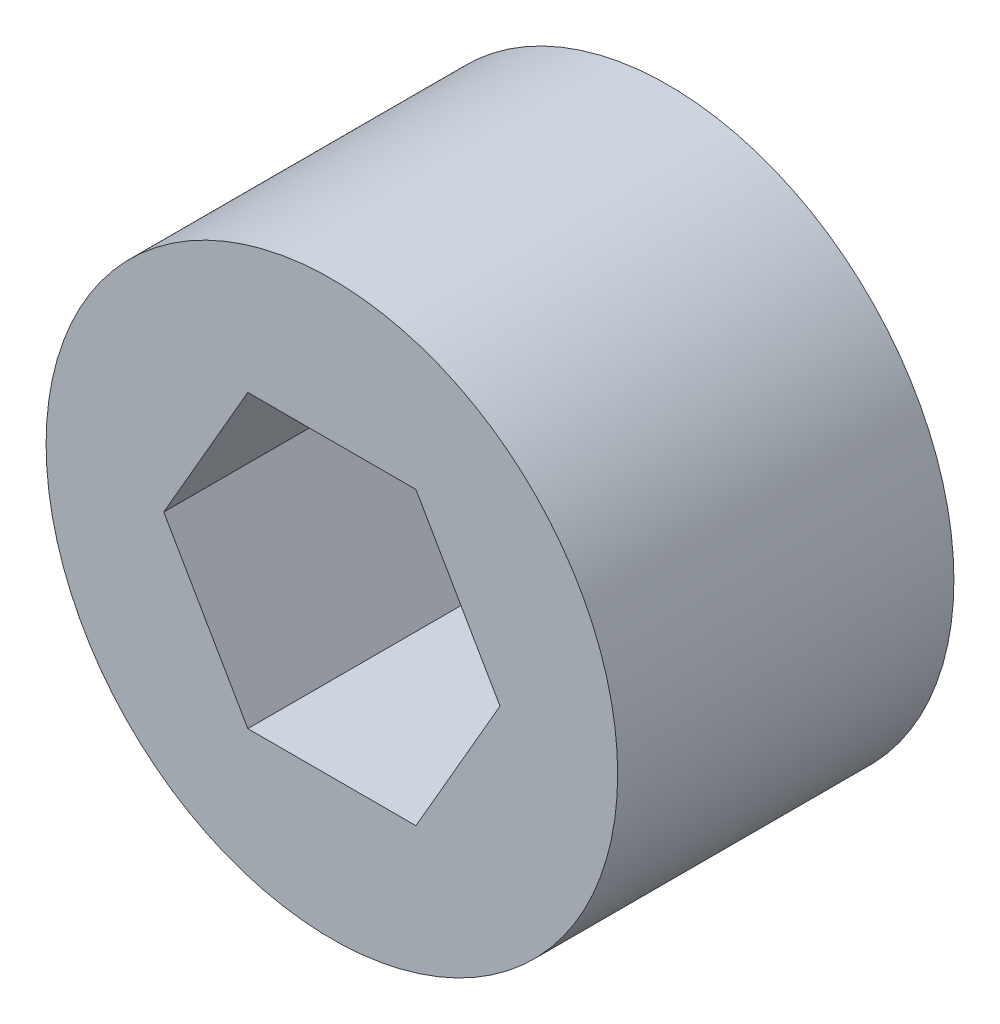
ISO-10303-21;
HEADER;
FILE_DESCRIPTION(('STEP AP214'),'2;1');
FILE_NAME('part.step','',(''),(''),'','','');
FILE_SCHEMA(('AUTOMOTIVE_DESIGN { 1 0 10303 214 1 1 1 1 }'));
ENDSEC;
DATA;
#1=APPLICATION_CONTEXT('core data for automotive mechanical design processes');
#2=APPLICATION_PROTOCOL_DEFINITION('international standard','automotive_design',2000,#1);
#3=PRODUCT_CONTEXT('',#1,'mechanical');
#4=PRODUCT('Part','Part','',(#3));
#5=PRODUCT_RELATED_PRODUCT_CATEGORY('part','',(#4));
#6=PRODUCT_DEFINITION_FORMATION('','',#4);
#7=PRODUCT_DEFINITION_CONTEXT('part definition',#1,'design');
#8=PRODUCT_DEFINITION('design','',#6,#7);
#9=PRODUCT_DEFINITION_SHAPE('','',#8);
#10=(LENGTH_UNIT() NAMED_UNIT(*) SI_UNIT(.MILLI.,.METRE.));
#11=(NAMED_UNIT(*) PLANE_ANGLE_UNIT() SI_UNIT($,.RADIAN.));
#12=(NAMED_UNIT(*) SI_UNIT($,.STERADIAN.) SOLID_ANGLE_UNIT());
#13=UNCERTAINTY_MEASURE_WITH_UNIT(LENGTH_MEASURE(1.E-05),#10,'distance_accuracy_value','');
#14=(GEOMETRIC_REPRESENTATION_CONTEXT(3) GLOBAL_UNCERTAINTY_ASSIGNED_CONTEXT((#13)) GLOBAL_UNIT_ASSIGNED_CONTEXT((#10,
#11,#12)) REPRESENTATION_CONTEXT('',''));
#15=CARTESIAN_POINT('',(0.,0.,0.));
#16=DIRECTION('',(0.,0.,1.));
#17=DIRECTION('',(1.,0.,0.));
#18=AXIS2_PLACEMENT_3D('',#15,#16,#17);
#19=CARTESIAN_POINT('',(0.,0.,10.));
#20=DIRECTION('',(0.,0.,1.));
#21=DIRECTION('',(1.,0.,0.));
#22=AXIS2_PLACEMENT_3D('',#19,#20,#21);
#23=PLANE('',#22);
#24=CARTESIAN_POINT('',(0.,0.,10.));
#25=DIRECTION('',(0.,0.,1.));
#26=DIRECTION('',(1.,0.,0.));
#27=AXIS2_PLACEMENT_3D('',#24,#25,#26);
#28=CIRCLE('',#27,8.5);
#29=CARTESIAN_POINT('',(8.5,0.,10.));
#30=VERTEX_POINT('',#29);
#31=EDGE_CURVE('E11',#30,#30,#28,.T.);
#32=ORIENTED_EDGE('',*,*,#31,.T.);
#33=EDGE_LOOP('',(#32));
#34=FACE_BOUND('',#33,.T.);
#35=DIRECTION('',(0.5,0.866025403784439,0.));
#36=VECTOR('',#35,1.);
#37=CARTESIAN_POINT('',(2.5,-4.33012701892219,10.));
#38=LINE('',#37,#36);
#39=CARTESIAN_POINT('',(2.5,-4.33012701892219,10.));
#40=VERTEX_POINT('',#39);
#41=CARTESIAN_POINT('',(5.,0.,10.));
#42=VERTEX_POINT('',#41);
#43=EDGE_CURVE('E94',#40,#42,#38,.T.);
#44=ORIENTED_EDGE('',*,*,#43,.F.);
#45=DIRECTION('',(1.,0.,0.));
#46=VECTOR('',#45,1.);
#47=CARTESIAN_POINT('',(-2.5,-4.33012701892219,10.));
#48=LINE('',#47,#46);
#49=CARTESIAN_POINT('',(-2.5,-4.33012701892219,10.));
#50=VERTEX_POINT('',#49);
#51=EDGE_CURVE('E86',#50,#40,#48,.T.);
#52=ORIENTED_EDGE('',*,*,#51,.F.);
#53=DIRECTION('',(0.5,-0.866025403784439,0.));
#54=VECTOR('',#53,1.);
#55=CARTESIAN_POINT('',(-5.,0.,10.));
#56=LINE('',#55,#54);
#57=CARTESIAN_POINT('',(-5.,0.,10.));
#58=VERTEX_POINT('',#57);
#59=EDGE_CURVE('E114',#58,#50,#56,.T.);
#60=ORIENTED_EDGE('',*,*,#59,.F.);
#61=DIRECTION('',(-0.5,-0.866025403784439,0.));
#62=VECTOR('',#61,1.);
#63=CARTESIAN_POINT('',(-2.5,4.33012701892219,10.));
#64=LINE('',#63,#62);
#65=CARTESIAN_POINT('',(-2.5,4.33012701892219,10.));
#66=VERTEX_POINT('',#65);
#67=EDGE_CURVE('E112',#66,#58,#64,.T.);
#68=ORIENTED_EDGE('',*,*,#67,.F.);
#69=DIRECTION('',(-1.,0.,0.));
#70=VECTOR('',#69,1.);
#71=CARTESIAN_POINT('',(2.5,4.33012701892219,10.));
#72=LINE('',#71,#70);
#73=CARTESIAN_POINT('',(2.5,4.33012701892219,10.));
#74=VERTEX_POINT('',#73);
#75=EDGE_CURVE('E108',#74,#66,#72,.T.);
#76=ORIENTED_EDGE('',*,*,#75,.F.);
#77=DIRECTION('',(-0.5,0.866025403784439,0.));
#78=VECTOR('',#77,1.);
#79=CARTESIAN_POINT('',(5.,0.,10.));
#80=LINE('',#79,#78);
#81=EDGE_CURVE('E106',#42,#74,#80,.T.);
#82=ORIENTED_EDGE('',*,*,#81,.F.);
#83=EDGE_LOOP('',(#44,#52,#60,#68,#76,#82));
#84=FACE_BOUND('',#83,.T.);
#85=ADVANCED_FACE('F33',(#34,#84),#23,.T.);
#86=CARTESIAN_POINT('',(0.,0.,0.));
#87=DIRECTION('',(0.,0.,1.));
#88=DIRECTION('',(1.,0.,0.));
#89=AXIS2_PLACEMENT_3D('',#86,#87,#88);
#90=PLANE('',#89);
#91=CARTESIAN_POINT('',(0.,0.,0.));
#92=DIRECTION('',(0.,0.,1.));
#93=DIRECTION('',(1.,0.,0.));
#94=AXIS2_PLACEMENT_3D('',#91,#92,#93);
#95=CIRCLE('',#94,8.5);
#96=CARTESIAN_POINT('',(8.5,0.,0.));
#97=VERTEX_POINT('',#96);
#98=EDGE_CURVE('E37',#97,#97,#95,.T.);
#99=ORIENTED_EDGE('',*,*,#98,.F.);
#100=EDGE_LOOP('',(#99));
#101=FACE_BOUND('',#100,.T.);
#102=DIRECTION('',(1.,0.,0.));
#103=VECTOR('',#102,1.);
#104=CARTESIAN_POINT('',(-2.5,-4.33012701892219,0.));
#105=LINE('',#104,#103);
#106=CARTESIAN_POINT('',(-2.5,-4.33012701892219,0.));
#107=VERTEX_POINT('',#106);
#108=CARTESIAN_POINT('',(2.5,-4.33012701892219,0.));
#109=VERTEX_POINT('',#108);
#110=EDGE_CURVE('E56',#107,#109,#105,.T.);
#111=ORIENTED_EDGE('',*,*,#110,.T.);
#112=DIRECTION('',(0.5,0.866025403784439,0.));
#113=VECTOR('',#112,1.);
#114=CARTESIAN_POINT('',(2.5,-4.33012701892219,0.));
#115=LINE('',#114,#113);
#116=CARTESIAN_POINT('',(5.,0.,0.));
#117=VERTEX_POINT('',#116);
#118=EDGE_CURVE('E101',#109,#117,#115,.T.);
#119=ORIENTED_EDGE('',*,*,#118,.T.);
#120=DIRECTION('',(-0.5,0.866025403784439,0.));
#121=VECTOR('',#120,1.);
#122=CARTESIAN_POINT('',(5.,0.,0.));
#123=LINE('',#122,#121);
#124=CARTESIAN_POINT('',(2.5,4.33012701892219,0.));
#125=VERTEX_POINT('',#124);
#126=EDGE_CURVE('E118',#117,#125,#123,.T.);
#127=ORIENTED_EDGE('',*,*,#126,.T.);
#128=DIRECTION('',(-1.,0.,0.));
#129=VECTOR('',#128,1.);
#130=CARTESIAN_POINT('',(2.5,4.33012701892219,0.));
#131=LINE('',#130,#129);
#132=CARTESIAN_POINT('',(-2.5,4.33012701892219,0.));
#133=VERTEX_POINT('',#132);
#134=EDGE_CURVE('E121',#125,#133,#131,.T.);
#135=ORIENTED_EDGE('',*,*,#134,.T.);
#136=DIRECTION('',(-0.5,-0.866025403784439,0.));
#137=VECTOR('',#136,1.);
#138=CARTESIAN_POINT('',(-2.5,4.33012701892219,0.));
#139=LINE('',#138,#137);
#140=CARTESIAN_POINT('',(-5.,0.,0.));
#141=VERTEX_POINT('',#140);
#142=EDGE_CURVE('E124',#133,#141,#139,.T.);
#143=ORIENTED_EDGE('',*,*,#142,.T.);
#144=DIRECTION('',(0.5,-0.866025403784439,0.));
#145=VECTOR('',#144,1.);
#146=CARTESIAN_POINT('',(-5.,0.,0.));
#147=LINE('',#146,#145);
#148=EDGE_CURVE('E95',#141,#107,#147,.T.);
#149=ORIENTED_EDGE('',*,*,#148,.T.);
#150=EDGE_LOOP('',(#111,#119,#127,#135,#143,#149));
#151=FACE_BOUND('',#150,.T.);
#152=ADVANCED_FACE('F141',(#101,#151),#90,.F.);
#153=CARTESIAN_POINT('',(0.,0.,10.));
#154=DIRECTION('',(0.,0.,-1.));
#155=DIRECTION('',(-1.,0.,0.));
#156=AXIS2_PLACEMENT_3D('',#153,#154,#155);
#157=CYLINDRICAL_SURFACE('',#156,8.5);
#158=ORIENTED_EDGE('',*,*,#31,.F.);
#159=EDGE_LOOP('',(#158));
#160=FACE_BOUND('',#159,.T.);
#161=ORIENTED_EDGE('',*,*,#98,.T.);
#162=EDGE_LOOP('',(#161));
#163=FACE_BOUND('',#162,.T.);
#164=ADVANCED_FACE('F35',(#160,#163),#157,.T.);
#165=CARTESIAN_POINT('',(-2.5,-4.33012701892219,10.));
#166=DIRECTION('',(0.,1.,0.));
#167=DIRECTION('',(-1.,0.,0.));
#168=AXIS2_PLACEMENT_3D('',#165,#166,#167);
#169=PLANE('',#168);
#170=ORIENTED_EDGE('',*,*,#110,.F.);
#171=DIRECTION('',(0.,0.,-1.));
#172=VECTOR('',#171,1.);
#173=CARTESIAN_POINT('',(-2.5,-4.33012701892219,10.));
#174=LINE('',#173,#172);
#175=EDGE_CURVE('E90',#50,#107,#174,.T.);
#176=ORIENTED_EDGE('',*,*,#175,.F.);
#177=ORIENTED_EDGE('',*,*,#51,.T.);
#178=DIRECTION('',(0.,0.,-1.));
#179=VECTOR('',#178,1.);
#180=CARTESIAN_POINT('',(2.5,-4.33012701892219,10.));
#181=LINE('',#180,#179);
#182=EDGE_CURVE('E89',#40,#109,#181,.T.);
#183=ORIENTED_EDGE('',*,*,#182,.T.);
#184=EDGE_LOOP('',(#170,#176,#177,#183));
#185=FACE_BOUND('',#184,.T.);
#186=ADVANCED_FACE('F88',(#185),#169,.T.);
#187=CARTESIAN_POINT('',(2.5,-4.33012701892219,10.));
#188=DIRECTION('',(-0.866025403784439,0.5,0.));
#189=DIRECTION('',(-0.5,-0.866025403784439,0.));
#190=AXIS2_PLACEMENT_3D('',#187,#188,#189);
#191=PLANE('',#190);
#192=ORIENTED_EDGE('',*,*,#118,.F.);
#193=ORIENTED_EDGE('',*,*,#182,.F.);
#194=ORIENTED_EDGE('',*,*,#43,.T.);
#195=DIRECTION('',(0.,0.,-1.));
#196=VECTOR('',#195,1.);
#197=CARTESIAN_POINT('',(5.,0.,10.));
#198=LINE('',#197,#196);
#199=EDGE_CURVE('E102',#42,#117,#198,.T.);
#200=ORIENTED_EDGE('',*,*,#199,.T.);
#201=EDGE_LOOP('',(#192,#193,#194,#200));
#202=FACE_BOUND('',#201,.T.);
#203=ADVANCED_FACE('F98',(#202),#191,.T.);
#204=CARTESIAN_POINT('',(5.,0.,10.));
#205=DIRECTION('',(-0.866025403784438,-0.5,0.));
#206=DIRECTION('',(0.5,-0.866025403784439,0.));
#207=AXIS2_PLACEMENT_3D('',#204,#205,#206);
#208=PLANE('',#207);
#209=ORIENTED_EDGE('',*,*,#126,.F.);
#210=ORIENTED_EDGE('',*,*,#199,.F.);
#211=ORIENTED_EDGE('',*,*,#81,.T.);
#212=DIRECTION('',(0.,0.,-1.));
#213=VECTOR('',#212,1.);
#214=CARTESIAN_POINT('',(2.5,4.33012701892219,10.));
#215=LINE('',#214,#213);
#216=EDGE_CURVE('E133',#74,#125,#215,.T.);
#217=ORIENTED_EDGE('',*,*,#216,.T.);
#218=EDGE_LOOP('',(#209,#210,#211,#217));
#219=FACE_BOUND('',#218,.T.);
#220=ADVANCED_FACE('F137',(#219),#208,.T.);
#221=CARTESIAN_POINT('',(2.5,4.33012701892219,10.));
#222=DIRECTION('',(0.,-1.,0.));
#223=DIRECTION('',(1.,0.,0.));
#224=AXIS2_PLACEMENT_3D('',#221,#222,#223);
#225=PLANE('',#224);
#226=ORIENTED_EDGE('',*,*,#134,.F.);
#227=ORIENTED_EDGE('',*,*,#216,.F.);
#228=ORIENTED_EDGE('',*,*,#75,.T.);
#229=DIRECTION('',(0.,0.,-1.));
#230=VECTOR('',#229,1.);
#231=CARTESIAN_POINT('',(-2.5,4.33012701892219,10.));
#232=LINE('',#231,#230);
#233=EDGE_CURVE('E131',#66,#133,#232,.T.);
#234=ORIENTED_EDGE('',*,*,#233,.T.);
#235=EDGE_LOOP('',(#226,#227,#228,#234));
#236=FACE_BOUND('',#235,.T.);
#237=ADVANCED_FACE('F149',(#236),#225,.T.);
#238=CARTESIAN_POINT('',(-2.5,4.33012701892219,10.));
#239=DIRECTION('',(0.866025403784439,-0.5,0.));
#240=DIRECTION('',(0.5,0.866025403784439,0.));
#241=AXIS2_PLACEMENT_3D('',#238,#239,#240);
#242=PLANE('',#241);
#243=ORIENTED_EDGE('',*,*,#142,.F.);
#244=ORIENTED_EDGE('',*,*,#233,.F.);
#245=ORIENTED_EDGE('',*,*,#67,.T.);
#246=DIRECTION('',(0.,0.,-1.));
#247=VECTOR('',#246,1.);
#248=CARTESIAN_POINT('',(-5.,0.,10.));
#249=LINE('',#248,#247);
#250=EDGE_CURVE('E48',#58,#141,#249,.T.);
#251=ORIENTED_EDGE('',*,*,#250,.T.);
#252=EDGE_LOOP('',(#243,#244,#245,#251));
#253=FACE_BOUND('',#252,.T.);
#254=ADVANCED_FACE('F147',(#253),#242,.T.);
#255=CARTESIAN_POINT('',(-5.,0.,10.));
#256=DIRECTION('',(0.866025403784439,0.5,0.));
#257=DIRECTION('',(-0.5,0.866025403784439,0.));
#258=AXIS2_PLACEMENT_3D('',#255,#256,#257);
#259=PLANE('',#258);
#260=ORIENTED_EDGE('',*,*,#148,.F.);
#261=ORIENTED_EDGE('',*,*,#250,.F.);
#262=ORIENTED_EDGE('',*,*,#59,.T.);
#263=ORIENTED_EDGE('',*,*,#175,.T.);
#264=EDGE_LOOP('',(#260,#261,#262,#263));
#265=FACE_BOUND('',#264,.T.);
#266=ADVANCED_FACE('F143',(#265),#259,.T.);
#267=CLOSED_SHELL('',(#85,#152,#164,#186,#203,#220,#237,#254,#266));
#268=MANIFOLD_SOLID_BREP('B2',#267);
#269=ADVANCED_BREP_SHAPE_REPRESENTATION('',(#18,#268),#14);
#270=SHAPE_DEFINITION_REPRESENTATION(#9,#269);
ENDSEC;
END-ISO-10303-21;
